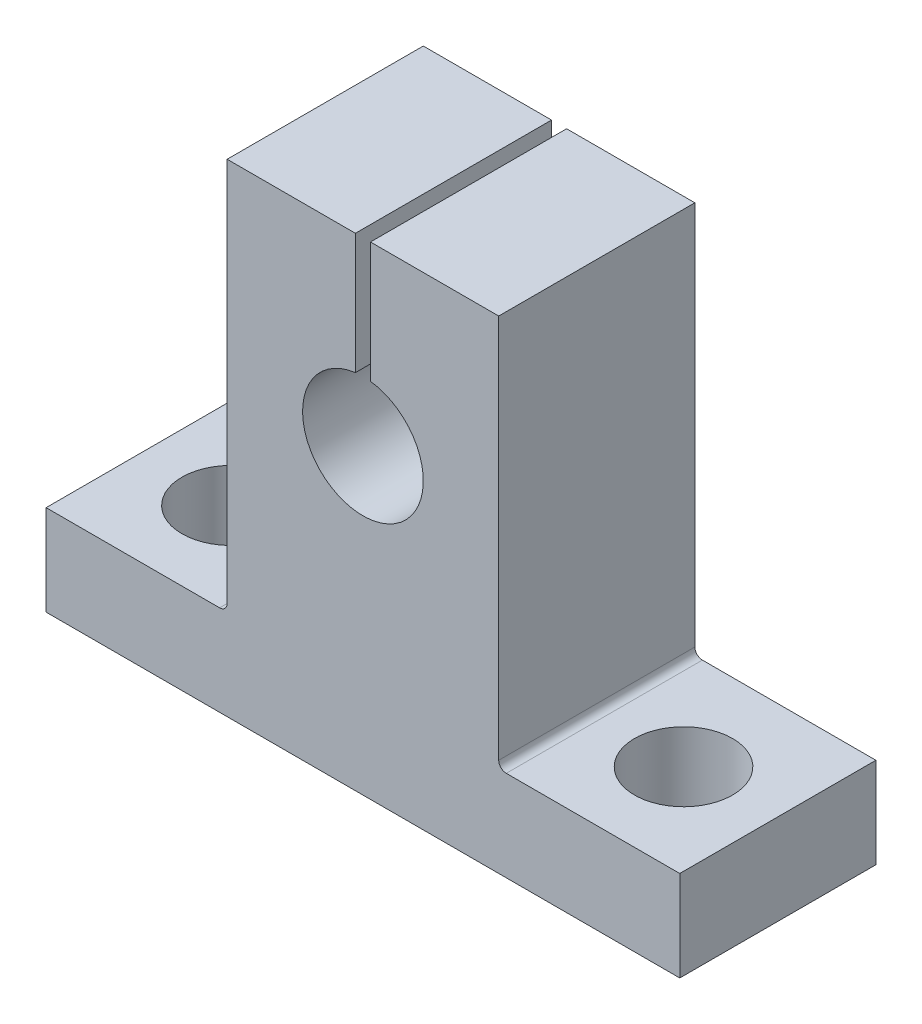
ISO-10303-21;
HEADER;
FILE_DESCRIPTION(('STEP AP214'),'2;1');
FILE_NAME('part.step','',(''),(''),'','','');
FILE_SCHEMA(('AUTOMOTIVE_DESIGN { 1 0 10303 214 1 1 1 1 }'));
ENDSEC;
DATA;
#1=APPLICATION_CONTEXT('core data for automotive mechanical design processes');
#2=APPLICATION_PROTOCOL_DEFINITION('international standard','automotive_design',2000,#1);
#3=PRODUCT_CONTEXT('',#1,'mechanical');
#4=PRODUCT('Part','Part','',(#3));
#5=PRODUCT_RELATED_PRODUCT_CATEGORY('part','',(#4));
#6=PRODUCT_DEFINITION_FORMATION('','',#4);
#7=PRODUCT_DEFINITION_CONTEXT('part definition',#1,'design');
#8=PRODUCT_DEFINITION('design','',#6,#7);
#9=PRODUCT_DEFINITION_SHAPE('','',#8);
#10=(LENGTH_UNIT() NAMED_UNIT(*) SI_UNIT(.MILLI.,.METRE.));
#11=(NAMED_UNIT(*) PLANE_ANGLE_UNIT() SI_UNIT($,.RADIAN.));
#12=(NAMED_UNIT(*) SI_UNIT($,.STERADIAN.) SOLID_ANGLE_UNIT());
#13=UNCERTAINTY_MEASURE_WITH_UNIT(LENGTH_MEASURE(1.E-05),#10,'distance_accuracy_value','');
#14=(GEOMETRIC_REPRESENTATION_CONTEXT(3) GLOBAL_UNCERTAINTY_ASSIGNED_CONTEXT((#13)) GLOBAL_UNIT_ASSIGNED_CONTEXT((#10,
#11,#12)) REPRESENTATION_CONTEXT('',''));
#15=CARTESIAN_POINT('',(0.,0.,0.));
#16=DIRECTION('',(0.,0.,1.));
#17=DIRECTION('',(1.,0.,0.));
#18=AXIS2_PLACEMENT_3D('',#15,#16,#17);
#19=CARTESIAN_POINT('',(-21.2857142857143,10.5,13.));
#20=DIRECTION('',(0.,1.,0.));
#21=DIRECTION('',(0.,0.,1.));
#22=AXIS2_PLACEMENT_3D('',#19,#20,#21);
#23=PLANE('',#22);
#24=DIRECTION('',(0.,0.,1.));
#25=VECTOR('',#24,1.);
#26=CARTESIAN_POINT('',(0.214285714285728,10.5,0.));
#27=LINE('',#26,#25);
#28=CARTESIAN_POINT('',(0.214285714285728,10.5,0.));
#29=VERTEX_POINT('',#28);
#30=CARTESIAN_POINT('',(0.214285714285728,10.5,13.));
#31=VERTEX_POINT('',#30);
#32=EDGE_CURVE('E169',#29,#31,#27,.T.);
#33=ORIENTED_EDGE('',*,*,#32,.T.);
#34=DIRECTION('',(1.,0.,0.));
#35=VECTOR('',#34,1.);
#36=CARTESIAN_POINT('',(-21.2857142857143,10.5,13.));
#37=LINE('',#36,#35);
#38=CARTESIAN_POINT('',(8.71428571428573,10.5,13.));
#39=VERTEX_POINT('',#38);
#40=EDGE_CURVE('E157',#31,#39,#37,.T.);
#41=ORIENTED_EDGE('',*,*,#40,.T.);
#42=DIRECTION('',(0.,0.,1.));
#43=VECTOR('',#42,1.);
#44=CARTESIAN_POINT('',(8.71428571428573,10.5,0.));
#45=LINE('',#44,#43);
#46=CARTESIAN_POINT('',(8.71428571428573,10.5,0.));
#47=VERTEX_POINT('',#46);
#48=EDGE_CURVE('E190',#47,#39,#45,.T.);
#49=ORIENTED_EDGE('',*,*,#48,.F.);
#50=DIRECTION('',(1.,0.,0.));
#51=VECTOR('',#50,1.);
#52=CARTESIAN_POINT('',(-21.2857142857143,10.5,0.));
#53=LINE('',#52,#51);
#54=EDGE_CURVE('E215',#29,#47,#53,.T.);
#55=ORIENTED_EDGE('',*,*,#54,.F.);
#56=EDGE_LOOP('',(#33,#41,#49,#55));
#57=FACE_BOUND('',#56,.T.);
#58=ADVANCED_FACE('F33',(#57),#23,.T.);
#59=CARTESIAN_POINT('',(-21.2857142857143,-21.5,13.));
#60=DIRECTION('',(-1.,0.,0.));
#61=DIRECTION('',(0.,-1.,0.));
#62=AXIS2_PLACEMENT_3D('',#59,#60,#61);
#63=PLANE('',#62);
#64=DIRECTION('',(0.,0.,1.));
#65=VECTOR('',#64,1.);
#66=CARTESIAN_POINT('',(-21.2857142857143,-15.5,0.));
#67=LINE('',#66,#65);
#68=CARTESIAN_POINT('',(-21.2857142857143,-15.5,0.));
#69=VERTEX_POINT('',#68);
#70=CARTESIAN_POINT('',(-21.2857142857143,-15.5,13.));
#71=VERTEX_POINT('',#70);
#72=EDGE_CURVE('E176',#69,#71,#67,.T.);
#73=ORIENTED_EDGE('',*,*,#72,.F.);
#74=DIRECTION('',(0.,1.,0.));
#75=VECTOR('',#74,1.);
#76=CARTESIAN_POINT('',(-21.2857142857143,-21.5,0.));
#77=LINE('',#76,#75);
#78=CARTESIAN_POINT('',(-21.2857142857143,-21.5,0.));
#79=VERTEX_POINT('',#78);
#80=EDGE_CURVE('E197',#79,#69,#77,.T.);
#81=ORIENTED_EDGE('',*,*,#80,.F.);
#82=DIRECTION('',(0.,0.,-1.));
#83=VECTOR('',#82,1.);
#84=CARTESIAN_POINT('',(-21.2857142857143,-21.5,13.));
#85=LINE('',#84,#83);
#86=CARTESIAN_POINT('',(-21.2857142857143,-21.5,13.));
#87=VERTEX_POINT('',#86);
#88=EDGE_CURVE('E223',#87,#79,#85,.T.);
#89=ORIENTED_EDGE('',*,*,#88,.F.);
#90=DIRECTION('',(0.,1.,0.));
#91=VECTOR('',#90,1.);
#92=CARTESIAN_POINT('',(-21.2857142857143,-21.5,13.));
#93=LINE('',#92,#91);
#94=EDGE_CURVE('E200',#87,#71,#93,.T.);
#95=ORIENTED_EDGE('',*,*,#94,.T.);
#96=EDGE_LOOP('',(#73,#81,#89,#95));
#97=FACE_BOUND('',#96,.T.);
#98=ADVANCED_FACE('F304',(#97),#63,.T.);
#99=CARTESIAN_POINT('',(20.7142857142857,-21.5,13.));
#100=DIRECTION('',(0.,-1.,0.));
#101=DIRECTION('',(0.,0.,-1.));
#102=AXIS2_PLACEMENT_3D('',#99,#100,#101);
#103=PLANE('',#102);
#104=CARTESIAN_POINT('',(-15.2857142857143,-21.5,6.7493585357509));
#105=DIRECTION('',(0.,1.,0.));
#106=DIRECTION('',(0.,0.,1.));
#107=AXIS2_PLACEMENT_3D('',#104,#105,#106);
#108=CIRCLE('',#107,3.24999999999999);
#109=CARTESIAN_POINT('',(-15.2857142857143,-21.5,9.99935853575089));
#110=VERTEX_POINT('',#109);
#111=EDGE_CURVE('E266',#110,#110,#108,.T.);
#112=ORIENTED_EDGE('',*,*,#111,.T.);
#113=EDGE_LOOP('',(#112));
#114=FACE_BOUND('',#113,.T.);
#115=CARTESIAN_POINT('',(14.7142857142857,-21.5,6.7493585357509));
#116=DIRECTION('',(0.,-1.,0.));
#117=DIRECTION('',(0.,0.,-1.));
#118=AXIS2_PLACEMENT_3D('',#115,#116,#117);
#119=CIRCLE('',#118,3.24999999999999);
#120=CARTESIAN_POINT('',(14.7142857142857,-21.5,3.49935853575091));
#121=VERTEX_POINT('',#120);
#122=EDGE_CURVE('E263',#121,#121,#119,.T.);
#123=ORIENTED_EDGE('',*,*,#122,.F.);
#124=EDGE_LOOP('',(#123));
#125=FACE_BOUND('',#124,.T.);
#126=DIRECTION('',(-1.,0.,0.));
#127=VECTOR('',#126,1.);
#128=CARTESIAN_POINT('',(20.7142857142857,-21.5,0.));
#129=LINE('',#128,#127);
#130=CARTESIAN_POINT('',(20.7142857142857,-21.5,0.));
#131=VERTEX_POINT('',#130);
#132=EDGE_CURVE('E203',#131,#79,#129,.T.);
#133=ORIENTED_EDGE('',*,*,#132,.F.);
#134=DIRECTION('',(0.,0.,-1.));
#135=VECTOR('',#134,1.);
#136=CARTESIAN_POINT('',(20.7142857142857,-21.5,13.));
#137=LINE('',#136,#135);
#138=CARTESIAN_POINT('',(20.7142857142857,-21.5,13.));
#139=VERTEX_POINT('',#138);
#140=EDGE_CURVE('E212',#139,#131,#137,.T.);
#141=ORIENTED_EDGE('',*,*,#140,.F.);
#142=DIRECTION('',(-1.,0.,0.));
#143=VECTOR('',#142,1.);
#144=CARTESIAN_POINT('',(20.7142857142857,-21.5,13.));
#145=LINE('',#144,#143);
#146=EDGE_CURVE('E209',#139,#87,#145,.T.);
#147=ORIENTED_EDGE('',*,*,#146,.T.);
#148=ORIENTED_EDGE('',*,*,#88,.T.);
#149=EDGE_LOOP('',(#133,#141,#147,#148));
#150=FACE_BOUND('',#149,.T.);
#151=ADVANCED_FACE('F309',(#114,#125,#150),#103,.T.);
#152=CARTESIAN_POINT('',(20.7142857142857,10.5,13.));
#153=DIRECTION('',(1.,0.,0.));
#154=DIRECTION('',(0.,1.,0.));
#155=AXIS2_PLACEMENT_3D('',#152,#153,#154);
#156=PLANE('',#155);
#157=DIRECTION('',(0.,0.,1.));
#158=VECTOR('',#157,1.);
#159=CARTESIAN_POINT('',(20.7142857142857,-15.5,0.));
#160=LINE('',#159,#158);
#161=CARTESIAN_POINT('',(20.7142857142857,-15.5,0.));
#162=VERTEX_POINT('',#161);
#163=CARTESIAN_POINT('',(20.7142857142857,-15.5,13.));
#164=VERTEX_POINT('',#163);
#165=EDGE_CURVE('E194',#162,#164,#160,.T.);
#166=ORIENTED_EDGE('',*,*,#165,.T.);
#167=DIRECTION('',(0.,-1.,0.));
#168=VECTOR('',#167,1.);
#169=CARTESIAN_POINT('',(20.7142857142857,10.5,13.));
#170=LINE('',#169,#168);
#171=EDGE_CURVE('E207',#164,#139,#170,.T.);
#172=ORIENTED_EDGE('',*,*,#171,.T.);
#173=ORIENTED_EDGE('',*,*,#140,.T.);
#174=DIRECTION('',(0.,-1.,0.));
#175=VECTOR('',#174,1.);
#176=CARTESIAN_POINT('',(20.7142857142857,10.5,0.));
#177=LINE('',#176,#175);
#178=EDGE_CURVE('E219',#162,#131,#177,.T.);
#179=ORIENTED_EDGE('',*,*,#178,.F.);
#180=EDGE_LOOP('',(#166,#172,#173,#179));
#181=FACE_BOUND('',#180,.T.);
#182=ADVANCED_FACE('F314',(#181),#156,.T.);
#183=DIRECTION('',(0.,0.,1.));
#184=VECTOR('',#183,1.);
#185=CARTESIAN_POINT('',(-0.785714285714271,10.5,0.));
#186=LINE('',#185,#184);
#187=CARTESIAN_POINT('',(-0.785714285714271,10.5,0.));
#188=VERTEX_POINT('',#187);
#189=CARTESIAN_POINT('',(-0.785714285714271,10.5,13.));
#190=VERTEX_POINT('',#189);
#191=EDGE_CURVE('E167',#188,#190,#186,.T.);
#192=ORIENTED_EDGE('',*,*,#191,.F.);
#193=CARTESIAN_POINT('',(-9.28571428571427,10.5,0.));
#194=VERTEX_POINT('',#193);
#195=EDGE_CURVE('E216',#194,#188,#53,.T.);
#196=ORIENTED_EDGE('',*,*,#195,.F.);
#197=DIRECTION('',(0.,0.,1.));
#198=VECTOR('',#197,1.);
#199=CARTESIAN_POINT('',(-9.28571428571427,10.5,0.));
#200=LINE('',#199,#198);
#201=CARTESIAN_POINT('',(-9.28571428571427,10.5,13.));
#202=VERTEX_POINT('',#201);
#203=EDGE_CURVE('E179',#194,#202,#200,.T.);
#204=ORIENTED_EDGE('',*,*,#203,.T.);
#205=EDGE_CURVE('E204',#202,#190,#37,.T.);
#206=ORIENTED_EDGE('',*,*,#205,.T.);
#207=EDGE_LOOP('',(#192,#196,#204,#206));
#208=FACE_BOUND('',#207,.T.);
#209=ADVANCED_FACE('F291',(#208),#23,.T.);
#210=CARTESIAN_POINT('',(0.,0.,13.));
#211=DIRECTION('',(0.,0.,-1.));
#212=DIRECTION('',(-1.,0.,0.));
#213=AXIS2_PLACEMENT_3D('',#210,#211,#212);
#214=PLANE('',#213);
#215=DIRECTION('',(0.,1.,0.));
#216=VECTOR('',#215,1.);
#217=CARTESIAN_POINT('',(0.214285714285729,2.50000000000001,13.));
#218=LINE('',#217,#216);
#219=CARTESIAN_POINT('',(0.214285714285729,2.50000000000001,13.));
#220=VERTEX_POINT('',#219);
#221=EDGE_CURVE('E148',#220,#31,#218,.T.);
#222=ORIENTED_EDGE('',*,*,#221,.F.);
#223=CARTESIAN_POINT('',(-0.285714285714271,-1.46862696659688,13.));
#224=DIRECTION('',(0.,0.,1.));
#225=DIRECTION('',(1.,0.,0.));
#226=AXIS2_PLACEMENT_3D('',#223,#224,#225);
#227=CIRCLE('',#226,4.);
#228=CARTESIAN_POINT('',(-0.785714285714271,2.50000000000001,13.));
#229=VERTEX_POINT('',#228);
#230=EDGE_CURVE('E132',#229,#220,#227,.T.);
#231=ORIENTED_EDGE('',*,*,#230,.F.);
#232=DIRECTION('',(0.,-1.,0.));
#233=VECTOR('',#232,1.);
#234=CARTESIAN_POINT('',(-0.785714285714271,10.5,13.));
#235=LINE('',#234,#233);
#236=EDGE_CURVE('E158',#190,#229,#235,.T.);
#237=ORIENTED_EDGE('',*,*,#236,.F.);
#238=ORIENTED_EDGE('',*,*,#205,.F.);
#239=DIRECTION('',(0.,1.,0.));
#240=VECTOR('',#239,1.);
#241=CARTESIAN_POINT('',(-9.28571428571427,-15.5,13.));
#242=LINE('',#241,#240);
#243=CARTESIAN_POINT('',(-9.28571428571427,-15.,13.));
#244=VERTEX_POINT('',#243);
#245=EDGE_CURVE('E174',#244,#202,#242,.T.);
#246=ORIENTED_EDGE('',*,*,#245,.F.);
#247=CARTESIAN_POINT('',(-9.78571428571427,-15.,13.));
#248=DIRECTION('',(0.,0.,-1.));
#249=DIRECTION('',(-1.,0.,0.));
#250=AXIS2_PLACEMENT_3D('',#247,#248,#249);
#251=CIRCLE('',#250,0.5);
#252=CARTESIAN_POINT('',(-9.78571428571427,-15.5,13.));
#253=VERTEX_POINT('',#252);
#254=EDGE_CURVE('E41',#244,#253,#251,.T.);
#255=ORIENTED_EDGE('',*,*,#254,.T.);
#256=DIRECTION('',(1.,0.,0.));
#257=VECTOR('',#256,1.);
#258=CARTESIAN_POINT('',(-21.2857142857143,-15.5,13.));
#259=LINE('',#258,#257);
#260=EDGE_CURVE('E152',#71,#253,#259,.T.);
#261=ORIENTED_EDGE('',*,*,#260,.F.);
#262=ORIENTED_EDGE('',*,*,#94,.F.);
#263=ORIENTED_EDGE('',*,*,#146,.F.);
#264=ORIENTED_EDGE('',*,*,#171,.F.);
#265=DIRECTION('',(1.,0.,0.));
#266=VECTOR('',#265,1.);
#267=CARTESIAN_POINT('',(8.71428571428573,-15.5,13.));
#268=LINE('',#267,#266);
#269=CARTESIAN_POINT('',(9.21428571428573,-15.5,13.));
#270=VERTEX_POINT('',#269);
#271=EDGE_CURVE('E188',#270,#164,#268,.T.);
#272=ORIENTED_EDGE('',*,*,#271,.F.);
#273=CARTESIAN_POINT('',(9.21428571428573,-15.,13.));
#274=DIRECTION('',(0.,0.,-1.));
#275=DIRECTION('',(-1.,0.,0.));
#276=AXIS2_PLACEMENT_3D('',#273,#274,#275);
#277=CIRCLE('',#276,0.5);
#278=CARTESIAN_POINT('',(8.71428571428573,-15.,13.));
#279=VERTEX_POINT('',#278);
#280=EDGE_CURVE('E236',#270,#279,#277,.T.);
#281=ORIENTED_EDGE('',*,*,#280,.T.);
#282=DIRECTION('',(0.,-1.,0.));
#283=VECTOR('',#282,1.);
#284=CARTESIAN_POINT('',(8.71428571428573,10.5,13.));
#285=LINE('',#284,#283);
#286=EDGE_CURVE('E182',#39,#279,#285,.T.);
#287=ORIENTED_EDGE('',*,*,#286,.F.);
#288=ORIENTED_EDGE('',*,*,#40,.F.);
#289=EDGE_LOOP('',(#222,#231,#237,#238,#246,#255,#261,#262,#263,#264,#272,#281,#287,#288));
#290=FACE_BOUND('',#289,.T.);
#291=ADVANCED_FACE('F155',(#290),#214,.F.);
#292=CARTESIAN_POINT('',(0.,0.,0.));
#293=DIRECTION('',(0.,0.,-1.));
#294=DIRECTION('',(-1.,0.,0.));
#295=AXIS2_PLACEMENT_3D('',#292,#293,#294);
#296=PLANE('',#295);
#297=CARTESIAN_POINT('',(-0.285714285714271,-1.46862696659688,0.));
#298=DIRECTION('',(0.,0.,1.));
#299=DIRECTION('',(1.,0.,0.));
#300=AXIS2_PLACEMENT_3D('',#297,#298,#299);
#301=CIRCLE('',#300,4.);
#302=CARTESIAN_POINT('',(-0.785714285714271,2.50000000000001,0.));
#303=VERTEX_POINT('',#302);
#304=CARTESIAN_POINT('',(0.214285714285729,2.50000000000001,0.));
#305=VERTEX_POINT('',#304);
#306=EDGE_CURVE('E142',#303,#305,#301,.T.);
#307=ORIENTED_EDGE('',*,*,#306,.T.);
#308=DIRECTION('',(0.,1.,0.));
#309=VECTOR('',#308,1.);
#310=CARTESIAN_POINT('',(0.214285714285729,2.50000000000001,0.));
#311=LINE('',#310,#309);
#312=EDGE_CURVE('E151',#305,#29,#311,.T.);
#313=ORIENTED_EDGE('',*,*,#312,.T.);
#314=ORIENTED_EDGE('',*,*,#54,.T.);
#315=DIRECTION('',(0.,-1.,0.));
#316=VECTOR('',#315,1.);
#317=CARTESIAN_POINT('',(8.71428571428573,10.5,0.));
#318=LINE('',#317,#316);
#319=CARTESIAN_POINT('',(8.71428571428573,-15.,0.));
#320=VERTEX_POINT('',#319);
#321=EDGE_CURVE('E184',#47,#320,#318,.T.);
#322=ORIENTED_EDGE('',*,*,#321,.T.);
#323=CARTESIAN_POINT('',(9.21428571428573,-15.,0.));
#324=DIRECTION('',(0.,0.,-1.));
#325=DIRECTION('',(-1.,0.,0.));
#326=AXIS2_PLACEMENT_3D('',#323,#324,#325);
#327=CIRCLE('',#326,0.5);
#328=CARTESIAN_POINT('',(9.21428571428573,-15.5,0.));
#329=VERTEX_POINT('',#328);
#330=EDGE_CURVE('E238',#320,#329,#327,.F.);
#331=ORIENTED_EDGE('',*,*,#330,.T.);
#332=DIRECTION('',(1.,0.,0.));
#333=VECTOR('',#332,1.);
#334=CARTESIAN_POINT('',(8.71428571428573,-15.5,0.));
#335=LINE('',#334,#333);
#336=EDGE_CURVE('E187',#329,#162,#335,.T.);
#337=ORIENTED_EDGE('',*,*,#336,.T.);
#338=ORIENTED_EDGE('',*,*,#178,.T.);
#339=ORIENTED_EDGE('',*,*,#132,.T.);
#340=ORIENTED_EDGE('',*,*,#80,.T.);
#341=DIRECTION('',(1.,0.,0.));
#342=VECTOR('',#341,1.);
#343=CARTESIAN_POINT('',(-21.2857142857143,-15.5,0.));
#344=LINE('',#343,#342);
#345=CARTESIAN_POINT('',(-9.78571428571427,-15.5,0.));
#346=VERTEX_POINT('',#345);
#347=EDGE_CURVE('E171',#69,#346,#344,.T.);
#348=ORIENTED_EDGE('',*,*,#347,.T.);
#349=CARTESIAN_POINT('',(-9.78571428571427,-15.,0.));
#350=DIRECTION('',(0.,0.,-1.));
#351=DIRECTION('',(-1.,0.,0.));
#352=AXIS2_PLACEMENT_3D('',#349,#350,#351);
#353=CIRCLE('',#352,0.5);
#354=CARTESIAN_POINT('',(-9.28571428571427,-15.,0.));
#355=VERTEX_POINT('',#354);
#356=EDGE_CURVE('E11',#346,#355,#353,.F.);
#357=ORIENTED_EDGE('',*,*,#356,.T.);
#358=DIRECTION('',(0.,1.,0.));
#359=VECTOR('',#358,1.);
#360=CARTESIAN_POINT('',(-9.28571428571427,-15.5,0.));
#361=LINE('',#360,#359);
#362=EDGE_CURVE('E173',#355,#194,#361,.T.);
#363=ORIENTED_EDGE('',*,*,#362,.T.);
#364=ORIENTED_EDGE('',*,*,#195,.T.);
#365=DIRECTION('',(0.,-1.,0.));
#366=VECTOR('',#365,1.);
#367=CARTESIAN_POINT('',(-0.785714285714271,10.5,0.));
#368=LINE('',#367,#366);
#369=EDGE_CURVE('E163',#188,#303,#368,.T.);
#370=ORIENTED_EDGE('',*,*,#369,.T.);
#371=EDGE_LOOP('',(#307,#313,#314,#322,#331,#337,#338,#339,#340,#348,#357,#363,#364,#370));
#372=FACE_BOUND('',#371,.T.);
#373=ADVANCED_FACE('F242',(#372),#296,.T.);
#374=CARTESIAN_POINT('',(8.71428571428573,-15.5,0.));
#375=DIRECTION('',(0.,-1.,0.));
#376=DIRECTION('',(0.,0.,-1.));
#377=AXIS2_PLACEMENT_3D('',#374,#375,#376);
#378=PLANE('',#377);
#379=CARTESIAN_POINT('',(14.7142857142857,-15.5,6.7493585357509));
#380=DIRECTION('',(0.,-1.,0.));
#381=DIRECTION('',(0.,0.,-1.));
#382=AXIS2_PLACEMENT_3D('',#379,#380,#381);
#383=CIRCLE('',#382,3.24999999999999);
#384=CARTESIAN_POINT('',(14.7142857142857,-15.5,3.49935853575091));
#385=VERTEX_POINT('',#384);
#386=EDGE_CURVE('E143',#385,#385,#383,.T.);
#387=ORIENTED_EDGE('',*,*,#386,.T.);
#388=EDGE_LOOP('',(#387));
#389=FACE_BOUND('',#388,.T.);
#390=ORIENTED_EDGE('',*,*,#336,.F.);
#391=DIRECTION('',(0.,0.,1.));
#392=VECTOR('',#391,1.);
#393=CARTESIAN_POINT('',(9.21428571428573,-15.5,13.));
#394=LINE('',#393,#392);
#395=EDGE_CURVE('E225',#329,#270,#394,.T.);
#396=ORIENTED_EDGE('',*,*,#395,.T.);
#397=ORIENTED_EDGE('',*,*,#271,.T.);
#398=ORIENTED_EDGE('',*,*,#165,.F.);
#399=EDGE_LOOP('',(#390,#396,#397,#398));
#400=FACE_BOUND('',#399,.T.);
#401=ADVANCED_FACE('F249',(#389,#400),#378,.F.);
#402=CARTESIAN_POINT('',(8.71428571428573,10.5,0.));
#403=DIRECTION('',(-1.,0.,0.));
#404=DIRECTION('',(0.,0.,1.));
#405=AXIS2_PLACEMENT_3D('',#402,#403,#404);
#406=PLANE('',#405);
#407=ORIENTED_EDGE('',*,*,#286,.T.);
#408=DIRECTION('',(0.,0.,1.));
#409=VECTOR('',#408,1.);
#410=CARTESIAN_POINT('',(8.71428571428573,-15.,0.));
#411=LINE('',#410,#409);
#412=EDGE_CURVE('E230',#279,#320,#411,.F.);
#413=ORIENTED_EDGE('',*,*,#412,.T.);
#414=ORIENTED_EDGE('',*,*,#321,.F.);
#415=ORIENTED_EDGE('',*,*,#48,.T.);
#416=EDGE_LOOP('',(#407,#413,#414,#415));
#417=FACE_BOUND('',#416,.T.);
#418=ADVANCED_FACE('F255',(#417),#406,.F.);
#419=CARTESIAN_POINT('',(-9.28571428571427,-15.5,0.));
#420=DIRECTION('',(1.,0.,0.));
#421=DIRECTION('',(0.,1.,0.));
#422=AXIS2_PLACEMENT_3D('',#419,#420,#421);
#423=PLANE('',#422);
#424=ORIENTED_EDGE('',*,*,#362,.F.);
#425=DIRECTION('',(0.,0.,1.));
#426=VECTOR('',#425,1.);
#427=CARTESIAN_POINT('',(-9.28571428571427,-15.,13.));
#428=LINE('',#427,#426);
#429=EDGE_CURVE('E232',#355,#244,#428,.T.);
#430=ORIENTED_EDGE('',*,*,#429,.T.);
#431=ORIENTED_EDGE('',*,*,#245,.T.);
#432=ORIENTED_EDGE('',*,*,#203,.F.);
#433=EDGE_LOOP('',(#424,#430,#431,#432));
#434=FACE_BOUND('',#433,.T.);
#435=ADVANCED_FACE('F277',(#434),#423,.F.);
#436=CARTESIAN_POINT('',(-21.2857142857143,-15.5,0.));
#437=DIRECTION('',(0.,-1.,0.));
#438=DIRECTION('',(1.,0.,0.));
#439=AXIS2_PLACEMENT_3D('',#436,#437,#438);
#440=PLANE('',#439);
#441=CARTESIAN_POINT('',(-15.2857142857143,-15.5,6.7493585357509));
#442=DIRECTION('',(0.,1.,0.));
#443=DIRECTION('',(0.,0.,1.));
#444=AXIS2_PLACEMENT_3D('',#441,#442,#443);
#445=CIRCLE('',#444,3.24999999999999);
#446=CARTESIAN_POINT('',(-15.2857142857143,-15.5,9.99935853575089));
#447=VERTEX_POINT('',#446);
#448=EDGE_CURVE('E269',#447,#447,#445,.T.);
#449=ORIENTED_EDGE('',*,*,#448,.F.);
#450=EDGE_LOOP('',(#449));
#451=FACE_BOUND('',#450,.T.);
#452=ORIENTED_EDGE('',*,*,#260,.T.);
#453=DIRECTION('',(0.,0.,1.));
#454=VECTOR('',#453,1.);
#455=CARTESIAN_POINT('',(-9.78571428571427,-15.5,0.));
#456=LINE('',#455,#454);
#457=EDGE_CURVE('E48',#253,#346,#456,.F.);
#458=ORIENTED_EDGE('',*,*,#457,.T.);
#459=ORIENTED_EDGE('',*,*,#347,.F.);
#460=ORIENTED_EDGE('',*,*,#72,.T.);
#461=EDGE_LOOP('',(#452,#458,#459,#460));
#462=FACE_BOUND('',#461,.T.);
#463=ADVANCED_FACE('F275',(#451,#462),#440,.F.);
#464=CARTESIAN_POINT('',(0.214285714285729,2.50000000000001,0.));
#465=DIRECTION('',(1.,0.,0.));
#466=DIRECTION('',(0.,1.,0.));
#467=AXIS2_PLACEMENT_3D('',#464,#465,#466);
#468=PLANE('',#467);
#469=ORIENTED_EDGE('',*,*,#221,.T.);
#470=ORIENTED_EDGE('',*,*,#32,.F.);
#471=ORIENTED_EDGE('',*,*,#312,.F.);
#472=DIRECTION('',(0.,0.,1.));
#473=VECTOR('',#472,1.);
#474=CARTESIAN_POINT('',(0.214285714285729,2.50000000000001,0.));
#475=LINE('',#474,#473);
#476=EDGE_CURVE('E135',#305,#220,#475,.T.);
#477=ORIENTED_EDGE('',*,*,#476,.T.);
#478=EDGE_LOOP('',(#469,#470,#471,#477));
#479=FACE_BOUND('',#478,.T.);
#480=ADVANCED_FACE('F147',(#479),#468,.F.);
#481=CARTESIAN_POINT('',(-0.785714285714271,10.5,0.));
#482=DIRECTION('',(-1.,0.,0.));
#483=DIRECTION('',(0.,-1.,0.));
#484=AXIS2_PLACEMENT_3D('',#481,#482,#483);
#485=PLANE('',#484);
#486=ORIENTED_EDGE('',*,*,#236,.T.);
#487=DIRECTION('',(0.,0.,1.));
#488=VECTOR('',#487,1.);
#489=CARTESIAN_POINT('',(-0.785714285714271,2.50000000000001,0.));
#490=LINE('',#489,#488);
#491=EDGE_CURVE('E138',#303,#229,#490,.T.);
#492=ORIENTED_EDGE('',*,*,#491,.F.);
#493=ORIENTED_EDGE('',*,*,#369,.F.);
#494=ORIENTED_EDGE('',*,*,#191,.T.);
#495=EDGE_LOOP('',(#486,#492,#493,#494));
#496=FACE_BOUND('',#495,.T.);
#497=ADVANCED_FACE('F293',(#496),#485,.F.);
#498=CARTESIAN_POINT('',(-0.285714285714271,-1.46862696659688,0.));
#499=DIRECTION('',(0.,0.,1.));
#500=DIRECTION('',(1.,0.,0.));
#501=AXIS2_PLACEMENT_3D('',#498,#499,#500);
#502=CYLINDRICAL_SURFACE('',#501,4.);
#503=ORIENTED_EDGE('',*,*,#306,.F.);
#504=ORIENTED_EDGE('',*,*,#491,.T.);
#505=ORIENTED_EDGE('',*,*,#230,.T.);
#506=ORIENTED_EDGE('',*,*,#476,.F.);
#507=EDGE_LOOP('',(#503,#504,#505,#506));
#508=FACE_BOUND('',#507,.T.);
#509=ADVANCED_FACE('F134',(#508),#502,.F.);
#510=CARTESIAN_POINT('',(14.7142857142857,-21.5,6.7493585357509));
#511=DIRECTION('',(0.,-1.,0.));
#512=DIRECTION('',(0.,0.,-1.));
#513=AXIS2_PLACEMENT_3D('',#510,#511,#512);
#514=CYLINDRICAL_SURFACE('',#513,3.24999999999999);
#515=ORIENTED_EDGE('',*,*,#122,.T.);
#516=EDGE_LOOP('',(#515));
#517=FACE_BOUND('',#516,.T.);
#518=ORIENTED_EDGE('',*,*,#386,.F.);
#519=EDGE_LOOP('',(#518));
#520=FACE_BOUND('',#519,.T.);
#521=ADVANCED_FACE('F300',(#517,#520),#514,.F.);
#522=CARTESIAN_POINT('',(-15.2857142857143,-15.5,6.7493585357509));
#523=DIRECTION('',(0.,1.,0.));
#524=DIRECTION('',(0.,0.,1.));
#525=AXIS2_PLACEMENT_3D('',#522,#523,#524);
#526=CYLINDRICAL_SURFACE('',#525,3.24999999999999);
#527=ORIENTED_EDGE('',*,*,#111,.F.);
#528=EDGE_LOOP('',(#527));
#529=FACE_BOUND('',#528,.T.);
#530=ORIENTED_EDGE('',*,*,#448,.T.);
#531=EDGE_LOOP('',(#530));
#532=FACE_BOUND('',#531,.T.);
#533=ADVANCED_FACE('F273',(#529,#532),#526,.F.);
#534=CARTESIAN_POINT('',(9.21428571428573,-15.,0.));
#535=DIRECTION('',(0.,0.,-1.));
#536=DIRECTION('',(-1.,0.,0.));
#537=AXIS2_PLACEMENT_3D('',#534,#535,#536);
#538=CYLINDRICAL_SURFACE('',#537,0.5);
#539=ORIENTED_EDGE('',*,*,#330,.F.);
#540=ORIENTED_EDGE('',*,*,#412,.F.);
#541=ORIENTED_EDGE('',*,*,#280,.F.);
#542=ORIENTED_EDGE('',*,*,#395,.F.);
#543=EDGE_LOOP('',(#539,#540,#541,#542));
#544=FACE_BOUND('',#543,.T.);
#545=ADVANCED_FACE('F252',(#544),#538,.F.);
#546=CARTESIAN_POINT('',(-9.78571428571427,-15.,0.));
#547=DIRECTION('',(0.,0.,-1.));
#548=DIRECTION('',(-1.,0.,0.));
#549=AXIS2_PLACEMENT_3D('',#546,#547,#548);
#550=CYLINDRICAL_SURFACE('',#549,0.5);
#551=ORIENTED_EDGE('',*,*,#356,.F.);
#552=ORIENTED_EDGE('',*,*,#457,.F.);
#553=ORIENTED_EDGE('',*,*,#254,.F.);
#554=ORIENTED_EDGE('',*,*,#429,.F.);
#555=EDGE_LOOP('',(#551,#552,#553,#554));
#556=FACE_BOUND('',#555,.T.);
#557=ADVANCED_FACE('F35',(#556),#550,.F.);
#558=CLOSED_SHELL('',(#58,#98,#151,#182,#209,#291,#373,#401,#418,#435,#463,#480,#497,#509,#521,
#533,#545,#557));
#559=MANIFOLD_SOLID_BREP('B2',#558);
#560=ADVANCED_BREP_SHAPE_REPRESENTATION('',(#18,#559),#14);
#561=SHAPE_DEFINITION_REPRESENTATION(#9,#560);
ENDSEC;
END-ISO-10303-21;
